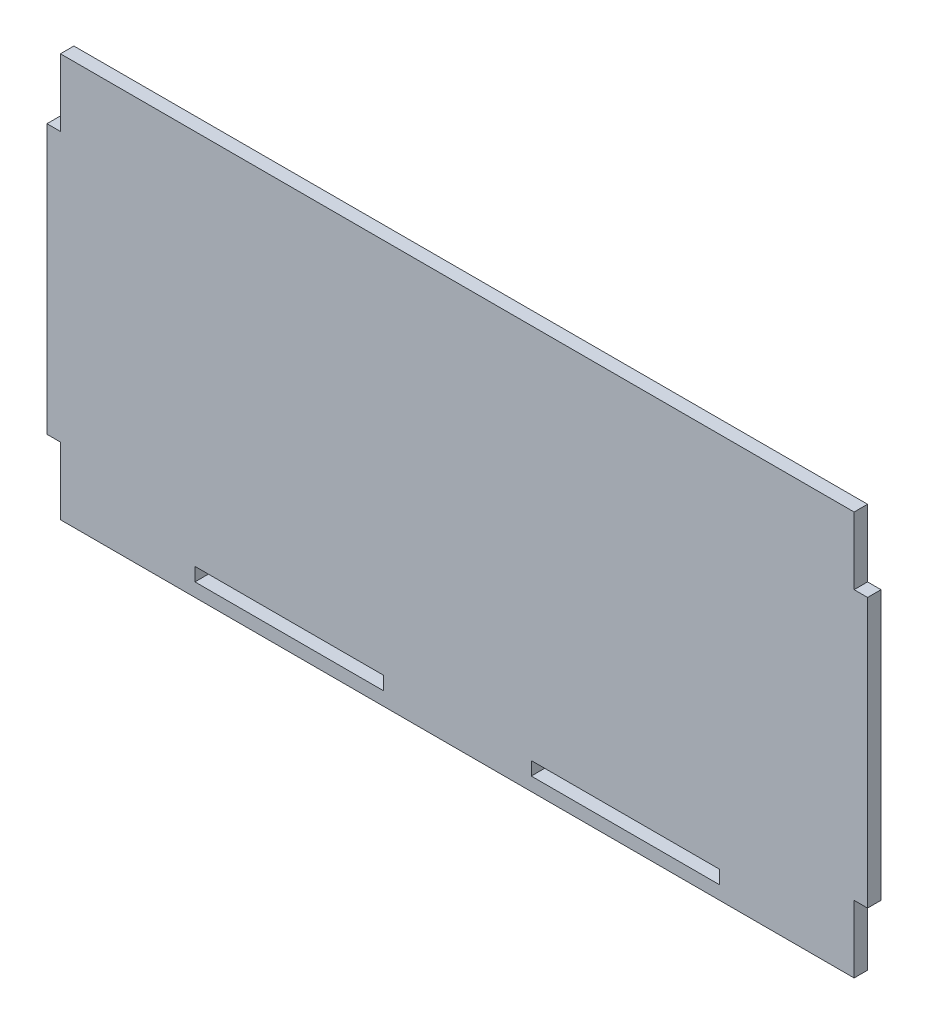
ISO-10303-21;
HEADER;
FILE_DESCRIPTION(('STEP AP214'),'2;1');
FILE_NAME('part.step','',(''),(''),'','','');
FILE_SCHEMA(('AUTOMOTIVE_DESIGN { 1 0 10303 214 1 1 1 1 }'));
ENDSEC;
DATA;
#1=APPLICATION_CONTEXT('core data for automotive mechanical design processes');
#2=APPLICATION_PROTOCOL_DEFINITION('international standard','automotive_design',2000,#1);
#3=PRODUCT_CONTEXT('',#1,'mechanical');
#4=PRODUCT('Part','Part','',(#3));
#5=PRODUCT_RELATED_PRODUCT_CATEGORY('part','',(#4));
#6=PRODUCT_DEFINITION_FORMATION('','',#4);
#7=PRODUCT_DEFINITION_CONTEXT('part definition',#1,'design');
#8=PRODUCT_DEFINITION('design','',#6,#7);
#9=PRODUCT_DEFINITION_SHAPE('','',#8);
#10=(LENGTH_UNIT() NAMED_UNIT(*) SI_UNIT(.MILLI.,.METRE.));
#11=(NAMED_UNIT(*) PLANE_ANGLE_UNIT() SI_UNIT($,.RADIAN.));
#12=(NAMED_UNIT(*) SI_UNIT($,.STERADIAN.) SOLID_ANGLE_UNIT());
#13=UNCERTAINTY_MEASURE_WITH_UNIT(LENGTH_MEASURE(1.E-05),#10,'distance_accuracy_value','');
#14=(GEOMETRIC_REPRESENTATION_CONTEXT(3) GLOBAL_UNCERTAINTY_ASSIGNED_CONTEXT((#13)) GLOBAL_UNIT_ASSIGNED_CONTEXT((#10,
#11,#12)) REPRESENTATION_CONTEXT('',''));
#15=CARTESIAN_POINT('',(0.,0.,0.));
#16=DIRECTION('',(0.,0.,1.));
#17=DIRECTION('',(1.,0.,0.));
#18=AXIS2_PLACEMENT_3D('',#15,#16,#17);
#19=CARTESIAN_POINT('',(0.,125.,5.));
#20=DIRECTION('',(0.,-1.,0.));
#21=DIRECTION('',(0.,0.,-1.));
#22=AXIS2_PLACEMENT_3D('',#19,#20,#21);
#23=PLANE('',#22);
#24=DIRECTION('',(-1.,0.,0.));
#25=VECTOR('',#24,1.);
#26=CARTESIAN_POINT('',(0.,125.,0.));
#27=LINE('',#26,#25);
#28=CARTESIAN_POINT('',(-295.,125.,0.));
#29=VERTEX_POINT('',#28);
#30=CARTESIAN_POINT('',(-300.,125.,0.));
#31=VERTEX_POINT('',#30);
#32=EDGE_CURVE('E207',#29,#31,#27,.T.);
#33=ORIENTED_EDGE('',*,*,#32,.T.);
#34=DIRECTION('',(0.,0.,-1.));
#35=VECTOR('',#34,1.);
#36=CARTESIAN_POINT('',(-300.,125.,5.));
#37=LINE('',#36,#35);
#38=CARTESIAN_POINT('',(-300.,125.,5.));
#39=VERTEX_POINT('',#38);
#40=EDGE_CURVE('E11',#39,#31,#37,.T.);
#41=ORIENTED_EDGE('',*,*,#40,.F.);
#42=DIRECTION('',(-1.,0.,0.));
#43=VECTOR('',#42,1.);
#44=CARTESIAN_POINT('',(0.,125.,5.));
#45=LINE('',#44,#43);
#46=CARTESIAN_POINT('',(-295.,125.,5.));
#47=VERTEX_POINT('',#46);
#48=EDGE_CURVE('E240',#47,#39,#45,.T.);
#49=ORIENTED_EDGE('',*,*,#48,.F.);
#50=DIRECTION('',(0.,0.,-1.));
#51=VECTOR('',#50,1.);
#52=CARTESIAN_POINT('',(-295.,125.,5.));
#53=LINE('',#52,#51);
#54=EDGE_CURVE('E298',#47,#29,#53,.T.);
#55=ORIENTED_EDGE('',*,*,#54,.T.);
#56=EDGE_LOOP('',(#33,#41,#49,#55));
#57=FACE_BOUND('',#56,.T.);
#58=ADVANCED_FACE('F34',(#57),#23,.F.);
#59=CARTESIAN_POINT('',(-300.,1.66533453693774E-13,5.));
#60=DIRECTION('',(1.,0.,0.));
#61=DIRECTION('',(0.,1.,0.));
#62=AXIS2_PLACEMENT_3D('',#59,#60,#61);
#63=PLANE('',#62);
#64=DIRECTION('',(0.,-1.,0.));
#65=VECTOR('',#64,1.);
#66=CARTESIAN_POINT('',(-300.,1.66533453693774E-13,0.));
#67=LINE('',#66,#65);
#68=CARTESIAN_POINT('',(-300.,25.,0.));
#69=VERTEX_POINT('',#68);
#70=EDGE_CURVE('E271',#31,#69,#67,.T.);
#71=ORIENTED_EDGE('',*,*,#70,.T.);
#72=DIRECTION('',(0.,0.,-1.));
#73=VECTOR('',#72,1.);
#74=CARTESIAN_POINT('',(-300.,25.,5.));
#75=LINE('',#74,#73);
#76=CARTESIAN_POINT('',(-300.,25.,5.));
#77=VERTEX_POINT('',#76);
#78=EDGE_CURVE('E41',#77,#69,#75,.T.);
#79=ORIENTED_EDGE('',*,*,#78,.F.);
#80=DIRECTION('',(0.,-1.,0.));
#81=VECTOR('',#80,1.);
#82=CARTESIAN_POINT('',(-300.,1.66533453693774E-13,5.));
#83=LINE('',#82,#81);
#84=EDGE_CURVE('E243',#39,#77,#83,.T.);
#85=ORIENTED_EDGE('',*,*,#84,.F.);
#86=ORIENTED_EDGE('',*,*,#40,.T.);
#87=EDGE_LOOP('',(#71,#79,#85,#86));
#88=FACE_BOUND('',#87,.T.);
#89=ADVANCED_FACE('F325',(#88),#63,.F.);
#90=CARTESIAN_POINT('',(0.,25.0000000000002,5.));
#91=DIRECTION('',(0.,-1.,0.));
#92=DIRECTION('',(1.,0.,0.));
#93=AXIS2_PLACEMENT_3D('',#90,#91,#92);
#94=PLANE('',#93);
#95=DIRECTION('',(-1.,0.,0.));
#96=VECTOR('',#95,1.);
#97=CARTESIAN_POINT('',(0.,25.0000000000002,0.));
#98=LINE('',#97,#96);
#99=CARTESIAN_POINT('',(-295.,25.,0.));
#100=VERTEX_POINT('',#99);
#101=EDGE_CURVE('E274',#100,#69,#98,.T.);
#102=ORIENTED_EDGE('',*,*,#101,.F.);
#103=DIRECTION('',(0.,0.,-1.));
#104=VECTOR('',#103,1.);
#105=CARTESIAN_POINT('',(-295.,25.,5.));
#106=LINE('',#105,#104);
#107=CARTESIAN_POINT('',(-295.,25.,5.));
#108=VERTEX_POINT('',#107);
#109=EDGE_CURVE('E318',#108,#100,#106,.T.);
#110=ORIENTED_EDGE('',*,*,#109,.F.);
#111=DIRECTION('',(-1.,0.,0.));
#112=VECTOR('',#111,1.);
#113=CARTESIAN_POINT('',(0.,25.0000000000002,5.));
#114=LINE('',#113,#112);
#115=EDGE_CURVE('E246',#108,#77,#114,.T.);
#116=ORIENTED_EDGE('',*,*,#115,.T.);
#117=ORIENTED_EDGE('',*,*,#78,.T.);
#118=EDGE_LOOP('',(#102,#110,#116,#117));
#119=FACE_BOUND('',#118,.T.);
#120=ADVANCED_FACE('F322',(#119),#94,.T.);
#121=CARTESIAN_POINT('',(-295.,0.,5.));
#122=DIRECTION('',(-1.,0.,0.));
#123=DIRECTION('',(0.,0.,1.));
#124=AXIS2_PLACEMENT_3D('',#121,#122,#123);
#125=PLANE('',#124);
#126=DIRECTION('',(0.,1.,0.));
#127=VECTOR('',#126,1.);
#128=CARTESIAN_POINT('',(-295.,0.,0.));
#129=LINE('',#128,#127);
#130=CARTESIAN_POINT('',(-295.,0.,0.));
#131=VERTEX_POINT('',#130);
#132=EDGE_CURVE('E277',#131,#100,#129,.T.);
#133=ORIENTED_EDGE('',*,*,#132,.F.);
#134=DIRECTION('',(0.,0.,-1.));
#135=VECTOR('',#134,1.);
#136=CARTESIAN_POINT('',(-295.,0.,5.));
#137=LINE('',#136,#135);
#138=CARTESIAN_POINT('',(-295.,0.,5.));
#139=VERTEX_POINT('',#138);
#140=EDGE_CURVE('E316',#139,#131,#137,.T.);
#141=ORIENTED_EDGE('',*,*,#140,.F.);
#142=DIRECTION('',(0.,1.,0.));
#143=VECTOR('',#142,1.);
#144=CARTESIAN_POINT('',(-295.,0.,5.));
#145=LINE('',#144,#143);
#146=EDGE_CURVE('E249',#139,#108,#145,.T.);
#147=ORIENTED_EDGE('',*,*,#146,.T.);
#148=ORIENTED_EDGE('',*,*,#109,.T.);
#149=EDGE_LOOP('',(#133,#141,#147,#148));
#150=FACE_BOUND('',#149,.T.);
#151=ADVANCED_FACE('F333',(#150),#125,.T.);
#152=CARTESIAN_POINT('',(0.,0.,5.));
#153=DIRECTION('',(0.,-1.,0.));
#154=DIRECTION('',(0.,0.,-1.));
#155=AXIS2_PLACEMENT_3D('',#152,#153,#154);
#156=PLANE('',#155);
#157=DIRECTION('',(-1.,0.,0.));
#158=VECTOR('',#157,1.);
#159=CARTESIAN_POINT('',(0.,0.,0.));
#160=LINE('',#159,#158);
#161=CARTESIAN_POINT('',(0.,0.,0.));
#162=VERTEX_POINT('',#161);
#163=EDGE_CURVE('E280',#162,#131,#160,.T.);
#164=ORIENTED_EDGE('',*,*,#163,.F.);
#165=DIRECTION('',(0.,0.,-1.));
#166=VECTOR('',#165,1.);
#167=CARTESIAN_POINT('',(0.,0.,5.));
#168=LINE('',#167,#166);
#169=CARTESIAN_POINT('',(0.,0.,5.));
#170=VERTEX_POINT('',#169);
#171=EDGE_CURVE('E314',#170,#162,#168,.T.);
#172=ORIENTED_EDGE('',*,*,#171,.F.);
#173=DIRECTION('',(-1.,0.,0.));
#174=VECTOR('',#173,1.);
#175=CARTESIAN_POINT('',(0.,0.,5.));
#176=LINE('',#175,#174);
#177=EDGE_CURVE('E252',#170,#139,#176,.T.);
#178=ORIENTED_EDGE('',*,*,#177,.T.);
#179=ORIENTED_EDGE('',*,*,#140,.T.);
#180=EDGE_LOOP('',(#164,#172,#178,#179));
#181=FACE_BOUND('',#180,.T.);
#182=ADVANCED_FACE('F373',(#181),#156,.T.);
#183=CARTESIAN_POINT('',(0.,0.,5.));
#184=DIRECTION('',(-1.,0.,0.));
#185=DIRECTION('',(0.,-1.,0.));
#186=AXIS2_PLACEMENT_3D('',#183,#184,#185);
#187=PLANE('',#186);
#188=DIRECTION('',(0.,1.,0.));
#189=VECTOR('',#188,1.);
#190=CARTESIAN_POINT('',(0.,0.,0.));
#191=LINE('',#190,#189);
#192=CARTESIAN_POINT('',(0.,25.,0.));
#193=VERTEX_POINT('',#192);
#194=EDGE_CURVE('E283',#162,#193,#191,.T.);
#195=ORIENTED_EDGE('',*,*,#194,.T.);
#196=DIRECTION('',(0.,0.,-1.));
#197=VECTOR('',#196,1.);
#198=CARTESIAN_POINT('',(0.,25.,5.));
#199=LINE('',#198,#197);
#200=CARTESIAN_POINT('',(0.,25.,5.));
#201=VERTEX_POINT('',#200);
#202=EDGE_CURVE('E311',#201,#193,#199,.T.);
#203=ORIENTED_EDGE('',*,*,#202,.F.);
#204=DIRECTION('',(0.,1.,0.));
#205=VECTOR('',#204,1.);
#206=CARTESIAN_POINT('',(0.,0.,5.));
#207=LINE('',#206,#205);
#208=EDGE_CURVE('E256',#170,#201,#207,.T.);
#209=ORIENTED_EDGE('',*,*,#208,.F.);
#210=ORIENTED_EDGE('',*,*,#171,.T.);
#211=EDGE_LOOP('',(#195,#203,#209,#210));
#212=FACE_BOUND('',#211,.T.);
#213=ADVANCED_FACE('F371',(#212),#187,.F.);
#214=CARTESIAN_POINT('',(0.,25.,5.));
#215=DIRECTION('',(0.,1.,0.));
#216=DIRECTION('',(-1.,0.,0.));
#217=AXIS2_PLACEMENT_3D('',#214,#215,#216);
#218=PLANE('',#217);
#219=DIRECTION('',(1.,0.,0.));
#220=VECTOR('',#219,1.);
#221=CARTESIAN_POINT('',(0.,25.,0.));
#222=LINE('',#221,#220);
#223=CARTESIAN_POINT('',(5.,25.,0.));
#224=VERTEX_POINT('',#223);
#225=EDGE_CURVE('E285',#193,#224,#222,.T.);
#226=ORIENTED_EDGE('',*,*,#225,.T.);
#227=DIRECTION('',(0.,0.,-1.));
#228=VECTOR('',#227,1.);
#229=CARTESIAN_POINT('',(5.,25.,5.));
#230=LINE('',#229,#228);
#231=CARTESIAN_POINT('',(5.,25.,5.));
#232=VERTEX_POINT('',#231);
#233=EDGE_CURVE('E309',#232,#224,#230,.T.);
#234=ORIENTED_EDGE('',*,*,#233,.F.);
#235=DIRECTION('',(1.,0.,0.));
#236=VECTOR('',#235,1.);
#237=CARTESIAN_POINT('',(0.,25.,5.));
#238=LINE('',#237,#236);
#239=EDGE_CURVE('E258',#201,#232,#238,.T.);
#240=ORIENTED_EDGE('',*,*,#239,.F.);
#241=ORIENTED_EDGE('',*,*,#202,.T.);
#242=EDGE_LOOP('',(#226,#234,#240,#241));
#243=FACE_BOUND('',#242,.T.);
#244=ADVANCED_FACE('F366',(#243),#218,.F.);
#245=CARTESIAN_POINT('',(5.00000000000002,0.,5.));
#246=DIRECTION('',(1.,0.,0.));
#247=DIRECTION('',(0.,1.,0.));
#248=AXIS2_PLACEMENT_3D('',#245,#246,#247);
#249=PLANE('',#248);
#250=DIRECTION('',(0.,-1.,0.));
#251=VECTOR('',#250,1.);
#252=CARTESIAN_POINT('',(5.00000000000002,0.,0.));
#253=LINE('',#252,#251);
#254=CARTESIAN_POINT('',(4.99999999999995,125.,0.));
#255=VERTEX_POINT('',#254);
#256=EDGE_CURVE('E289',#255,#224,#253,.T.);
#257=ORIENTED_EDGE('',*,*,#256,.F.);
#258=DIRECTION('',(0.,0.,-1.));
#259=VECTOR('',#258,1.);
#260=CARTESIAN_POINT('',(4.99999999999995,125.,5.));
#261=LINE('',#260,#259);
#262=CARTESIAN_POINT('',(4.99999999999995,125.,5.));
#263=VERTEX_POINT('',#262);
#264=EDGE_CURVE('E307',#263,#255,#261,.T.);
#265=ORIENTED_EDGE('',*,*,#264,.F.);
#266=DIRECTION('',(0.,-1.,0.));
#267=VECTOR('',#266,1.);
#268=CARTESIAN_POINT('',(5.00000000000002,0.,5.));
#269=LINE('',#268,#267);
#270=EDGE_CURVE('E261',#263,#232,#269,.T.);
#271=ORIENTED_EDGE('',*,*,#270,.T.);
#272=ORIENTED_EDGE('',*,*,#233,.T.);
#273=EDGE_LOOP('',(#257,#265,#271,#272));
#274=FACE_BOUND('',#273,.T.);
#275=ADVANCED_FACE('F362',(#274),#249,.T.);
#276=CARTESIAN_POINT('',(0.,125.,5.));
#277=DIRECTION('',(0.,1.,0.));
#278=DIRECTION('',(0.,0.,1.));
#279=AXIS2_PLACEMENT_3D('',#276,#277,#278);
#280=PLANE('',#279);
#281=DIRECTION('',(1.,0.,0.));
#282=VECTOR('',#281,1.);
#283=CARTESIAN_POINT('',(0.,125.,0.));
#284=LINE('',#283,#282);
#285=CARTESIAN_POINT('',(0.,125.,0.));
#286=VERTEX_POINT('',#285);
#287=EDGE_CURVE('E292',#286,#255,#284,.T.);
#288=ORIENTED_EDGE('',*,*,#287,.F.);
#289=DIRECTION('',(0.,0.,-1.));
#290=VECTOR('',#289,1.);
#291=CARTESIAN_POINT('',(0.,125.,5.));
#292=LINE('',#291,#290);
#293=CARTESIAN_POINT('',(0.,125.,5.));
#294=VERTEX_POINT('',#293);
#295=EDGE_CURVE('E305',#294,#286,#292,.T.);
#296=ORIENTED_EDGE('',*,*,#295,.F.);
#297=DIRECTION('',(1.,0.,0.));
#298=VECTOR('',#297,1.);
#299=CARTESIAN_POINT('',(0.,125.,5.));
#300=LINE('',#299,#298);
#301=EDGE_CURVE('E264',#294,#263,#300,.T.);
#302=ORIENTED_EDGE('',*,*,#301,.T.);
#303=ORIENTED_EDGE('',*,*,#264,.T.);
#304=EDGE_LOOP('',(#288,#296,#302,#303));
#305=FACE_BOUND('',#304,.T.);
#306=ADVANCED_FACE('F356',(#305),#280,.T.);
#307=CARTESIAN_POINT('',(0.,150.,0.));
#308=VERTEX_POINT('',#307);
#309=EDGE_CURVE('E286',#286,#308,#191,.T.);
#310=ORIENTED_EDGE('',*,*,#309,.T.);
#311=DIRECTION('',(0.,0.,-1.));
#312=VECTOR('',#311,1.);
#313=CARTESIAN_POINT('',(0.,150.,5.));
#314=LINE('',#313,#312);
#315=CARTESIAN_POINT('',(0.,150.,5.));
#316=VERTEX_POINT('',#315);
#317=EDGE_CURVE('E302',#316,#308,#314,.T.);
#318=ORIENTED_EDGE('',*,*,#317,.F.);
#319=EDGE_CURVE('E259',#294,#316,#207,.T.);
#320=ORIENTED_EDGE('',*,*,#319,.F.);
#321=ORIENTED_EDGE('',*,*,#295,.T.);
#322=EDGE_LOOP('',(#310,#318,#320,#321));
#323=FACE_BOUND('',#322,.T.);
#324=ADVANCED_FACE('F374',(#323),#187,.F.);
#325=CARTESIAN_POINT('',(0.,150.,5.));
#326=DIRECTION('',(0.,-1.,0.));
#327=DIRECTION('',(1.,0.,0.));
#328=AXIS2_PLACEMENT_3D('',#325,#326,#327);
#329=PLANE('',#328);
#330=DIRECTION('',(-1.,0.,0.));
#331=VECTOR('',#330,1.);
#332=CARTESIAN_POINT('',(0.,150.,0.));
#333=LINE('',#332,#331);
#334=CARTESIAN_POINT('',(-295.,150.,0.));
#335=VERTEX_POINT('',#334);
#336=EDGE_CURVE('E295',#308,#335,#333,.T.);
#337=ORIENTED_EDGE('',*,*,#336,.T.);
#338=DIRECTION('',(0.,0.,-1.));
#339=VECTOR('',#338,1.);
#340=CARTESIAN_POINT('',(-295.,150.,5.));
#341=LINE('',#340,#339);
#342=CARTESIAN_POINT('',(-295.,150.,5.));
#343=VERTEX_POINT('',#342);
#344=EDGE_CURVE('E300',#343,#335,#341,.T.);
#345=ORIENTED_EDGE('',*,*,#344,.F.);
#346=DIRECTION('',(-1.,0.,0.));
#347=VECTOR('',#346,1.);
#348=CARTESIAN_POINT('',(0.,150.,5.));
#349=LINE('',#348,#347);
#350=EDGE_CURVE('E267',#316,#343,#349,.T.);
#351=ORIENTED_EDGE('',*,*,#350,.F.);
#352=ORIENTED_EDGE('',*,*,#317,.T.);
#353=EDGE_LOOP('',(#337,#345,#351,#352));
#354=FACE_BOUND('',#353,.T.);
#355=ADVANCED_FACE('F350',(#354),#329,.F.);
#356=EDGE_CURVE('E244',#29,#335,#129,.T.);
#357=ORIENTED_EDGE('',*,*,#356,.F.);
#358=ORIENTED_EDGE('',*,*,#54,.F.);
#359=EDGE_CURVE('E253',#47,#343,#145,.T.);
#360=ORIENTED_EDGE('',*,*,#359,.T.);
#361=ORIENTED_EDGE('',*,*,#344,.T.);
#362=EDGE_LOOP('',(#357,#358,#360,#361));
#363=FACE_BOUND('',#362,.T.);
#364=ADVANCED_FACE('F346',(#363),#125,.T.);
#365=CARTESIAN_POINT('',(0.,0.,5.));
#366=DIRECTION('',(0.,0.,1.));
#367=DIRECTION('',(1.,0.,0.));
#368=AXIS2_PLACEMENT_3D('',#365,#366,#367);
#369=PLANE('',#368);
#370=DIRECTION('',(0.,-1.,0.));
#371=VECTOR('',#370,1.);
#372=CARTESIAN_POINT('',(-245.,5.,5.));
#373=LINE('',#372,#371);
#374=CARTESIAN_POINT('',(-245.,10.,5.));
#375=VERTEX_POINT('',#374);
#376=CARTESIAN_POINT('',(-245.,5.,5.));
#377=VERTEX_POINT('',#376);
#378=EDGE_CURVE('E48',#375,#377,#373,.T.);
#379=ORIENTED_EDGE('',*,*,#378,.F.);
#380=DIRECTION('',(-1.,0.,0.));
#381=VECTOR('',#380,1.);
#382=CARTESIAN_POINT('',(-245.,10.,5.));
#383=LINE('',#382,#381);
#384=CARTESIAN_POINT('',(-175.,10.,5.));
#385=VERTEX_POINT('',#384);
#386=EDGE_CURVE('E191',#385,#375,#383,.T.);
#387=ORIENTED_EDGE('',*,*,#386,.F.);
#388=DIRECTION('',(0.,1.,0.));
#389=VECTOR('',#388,1.);
#390=CARTESIAN_POINT('',(-175.,5.,5.));
#391=LINE('',#390,#389);
#392=CARTESIAN_POINT('',(-175.,5.,5.));
#393=VERTEX_POINT('',#392);
#394=EDGE_CURVE('E194',#393,#385,#391,.T.);
#395=ORIENTED_EDGE('',*,*,#394,.F.);
#396=DIRECTION('',(1.,0.,0.));
#397=VECTOR('',#396,1.);
#398=CARTESIAN_POINT('',(-245.,5.,5.));
#399=LINE('',#398,#397);
#400=EDGE_CURVE('E200',#377,#393,#399,.T.);
#401=ORIENTED_EDGE('',*,*,#400,.F.);
#402=EDGE_LOOP('',(#379,#387,#395,#401));
#403=FACE_BOUND('',#402,.T.);
#404=DIRECTION('',(1.,0.,0.));
#405=VECTOR('',#404,1.);
#406=CARTESIAN_POINT('',(-50.,5.,5.));
#407=LINE('',#406,#405);
#408=CARTESIAN_POINT('',(-120.,5.,5.));
#409=VERTEX_POINT('',#408);
#410=CARTESIAN_POINT('',(-50.,5.,5.));
#411=VERTEX_POINT('',#410);
#412=EDGE_CURVE('E56',#409,#411,#407,.T.);
#413=ORIENTED_EDGE('',*,*,#412,.F.);
#414=DIRECTION('',(0.,-1.,0.));
#415=VECTOR('',#414,1.);
#416=CARTESIAN_POINT('',(-120.,5.,5.));
#417=LINE('',#416,#415);
#418=CARTESIAN_POINT('',(-120.,10.,5.));
#419=VERTEX_POINT('',#418);
#420=EDGE_CURVE('E215',#419,#409,#417,.T.);
#421=ORIENTED_EDGE('',*,*,#420,.F.);
#422=DIRECTION('',(-1.,0.,0.));
#423=VECTOR('',#422,1.);
#424=CARTESIAN_POINT('',(-50.,10.,5.));
#425=LINE('',#424,#423);
#426=CARTESIAN_POINT('',(-50.,10.,5.));
#427=VERTEX_POINT('',#426);
#428=EDGE_CURVE('E229',#427,#419,#425,.T.);
#429=ORIENTED_EDGE('',*,*,#428,.F.);
#430=DIRECTION('',(0.,1.,0.));
#431=VECTOR('',#430,1.);
#432=CARTESIAN_POINT('',(-50.,5.,5.));
#433=LINE('',#432,#431);
#434=EDGE_CURVE('E226',#411,#427,#433,.T.);
#435=ORIENTED_EDGE('',*,*,#434,.F.);
#436=EDGE_LOOP('',(#413,#421,#429,#435));
#437=FACE_BOUND('',#436,.T.);
#438=ORIENTED_EDGE('',*,*,#48,.T.);
#439=ORIENTED_EDGE('',*,*,#84,.T.);
#440=ORIENTED_EDGE('',*,*,#115,.F.);
#441=ORIENTED_EDGE('',*,*,#146,.F.);
#442=ORIENTED_EDGE('',*,*,#177,.F.);
#443=ORIENTED_EDGE('',*,*,#208,.T.);
#444=ORIENTED_EDGE('',*,*,#239,.T.);
#445=ORIENTED_EDGE('',*,*,#270,.F.);
#446=ORIENTED_EDGE('',*,*,#301,.F.);
#447=ORIENTED_EDGE('',*,*,#319,.T.);
#448=ORIENTED_EDGE('',*,*,#350,.T.);
#449=ORIENTED_EDGE('',*,*,#359,.F.);
#450=EDGE_LOOP('',(#438,#439,#440,#441,#442,#443,#444,#445,#446,#447,#448,#449));
#451=FACE_BOUND('',#450,.T.);
#452=ADVANCED_FACE('F336',(#403,#437,#451),#369,.T.);
#453=CARTESIAN_POINT('',(0.,0.,0.));
#454=DIRECTION('',(0.,0.,1.));
#455=DIRECTION('',(1.,0.,0.));
#456=AXIS2_PLACEMENT_3D('',#453,#454,#455);
#457=PLANE('',#456);
#458=DIRECTION('',(-1.,0.,0.));
#459=VECTOR('',#458,1.);
#460=CARTESIAN_POINT('',(-245.,10.,0.));
#461=LINE('',#460,#459);
#462=CARTESIAN_POINT('',(-175.,10.,0.));
#463=VERTEX_POINT('',#462);
#464=CARTESIAN_POINT('',(-245.,10.,0.));
#465=VERTEX_POINT('',#464);
#466=EDGE_CURVE('E178',#463,#465,#461,.T.);
#467=ORIENTED_EDGE('',*,*,#466,.T.);
#468=DIRECTION('',(0.,-1.,0.));
#469=VECTOR('',#468,1.);
#470=CARTESIAN_POINT('',(-245.,5.,0.));
#471=LINE('',#470,#469);
#472=CARTESIAN_POINT('',(-245.,5.,0.));
#473=VERTEX_POINT('',#472);
#474=EDGE_CURVE('E172',#465,#473,#471,.T.);
#475=ORIENTED_EDGE('',*,*,#474,.T.);
#476=DIRECTION('',(1.,0.,0.));
#477=VECTOR('',#476,1.);
#478=CARTESIAN_POINT('',(-245.,5.,0.));
#479=LINE('',#478,#477);
#480=CARTESIAN_POINT('',(-175.,5.,0.));
#481=VERTEX_POINT('',#480);
#482=EDGE_CURVE('E182',#473,#481,#479,.T.);
#483=ORIENTED_EDGE('',*,*,#482,.T.);
#484=DIRECTION('',(0.,1.,0.));
#485=VECTOR('',#484,1.);
#486=CARTESIAN_POINT('',(-175.,5.,0.));
#487=LINE('',#486,#485);
#488=EDGE_CURVE('E186',#481,#463,#487,.T.);
#489=ORIENTED_EDGE('',*,*,#488,.T.);
#490=EDGE_LOOP('',(#467,#475,#483,#489));
#491=FACE_BOUND('',#490,.T.);
#492=DIRECTION('',(0.,-1.,0.));
#493=VECTOR('',#492,1.);
#494=CARTESIAN_POINT('',(-120.,5.,0.));
#495=LINE('',#494,#493);
#496=CARTESIAN_POINT('',(-120.,10.,0.));
#497=VERTEX_POINT('',#496);
#498=CARTESIAN_POINT('',(-120.,5.,0.));
#499=VERTEX_POINT('',#498);
#500=EDGE_CURVE('E221',#497,#499,#495,.T.);
#501=ORIENTED_EDGE('',*,*,#500,.T.);
#502=DIRECTION('',(1.,0.,0.));
#503=VECTOR('',#502,1.);
#504=CARTESIAN_POINT('',(-50.,5.,0.));
#505=LINE('',#504,#503);
#506=CARTESIAN_POINT('',(-50.,5.,0.));
#507=VERTEX_POINT('',#506);
#508=EDGE_CURVE('E211',#499,#507,#505,.T.);
#509=ORIENTED_EDGE('',*,*,#508,.T.);
#510=DIRECTION('',(0.,1.,0.));
#511=VECTOR('',#510,1.);
#512=CARTESIAN_POINT('',(-50.,5.,0.));
#513=LINE('',#512,#511);
#514=CARTESIAN_POINT('',(-50.,10.,0.));
#515=VERTEX_POINT('',#514);
#516=EDGE_CURVE('E214',#507,#515,#513,.T.);
#517=ORIENTED_EDGE('',*,*,#516,.T.);
#518=DIRECTION('',(-1.,0.,0.));
#519=VECTOR('',#518,1.);
#520=CARTESIAN_POINT('',(-50.,10.,0.));
#521=LINE('',#520,#519);
#522=EDGE_CURVE('E218',#515,#497,#521,.T.);
#523=ORIENTED_EDGE('',*,*,#522,.T.);
#524=EDGE_LOOP('',(#501,#509,#517,#523));
#525=FACE_BOUND('',#524,.T.);
#526=ORIENTED_EDGE('',*,*,#32,.F.);
#527=ORIENTED_EDGE('',*,*,#356,.T.);
#528=ORIENTED_EDGE('',*,*,#336,.F.);
#529=ORIENTED_EDGE('',*,*,#309,.F.);
#530=ORIENTED_EDGE('',*,*,#287,.T.);
#531=ORIENTED_EDGE('',*,*,#256,.T.);
#532=ORIENTED_EDGE('',*,*,#225,.F.);
#533=ORIENTED_EDGE('',*,*,#194,.F.);
#534=ORIENTED_EDGE('',*,*,#163,.T.);
#535=ORIENTED_EDGE('',*,*,#132,.T.);
#536=ORIENTED_EDGE('',*,*,#101,.T.);
#537=ORIENTED_EDGE('',*,*,#70,.F.);
#538=EDGE_LOOP('',(#526,#527,#528,#529,#530,#531,#532,#533,#534,#535,#536,#537));
#539=FACE_BOUND('',#538,.T.);
#540=ADVANCED_FACE('F188',(#491,#525,#539),#457,.F.);
#541=CARTESIAN_POINT('',(-50.,5.,0.));
#542=DIRECTION('',(0.,-1.,0.));
#543=DIRECTION('',(0.,0.,-1.));
#544=AXIS2_PLACEMENT_3D('',#541,#542,#543);
#545=PLANE('',#544);
#546=ORIENTED_EDGE('',*,*,#412,.T.);
#547=DIRECTION('',(0.,0.,1.));
#548=VECTOR('',#547,1.);
#549=CARTESIAN_POINT('',(-50.,5.,0.));
#550=LINE('',#549,#548);
#551=EDGE_CURVE('E224',#507,#411,#550,.T.);
#552=ORIENTED_EDGE('',*,*,#551,.F.);
#553=ORIENTED_EDGE('',*,*,#508,.F.);
#554=DIRECTION('',(0.,0.,1.));
#555=VECTOR('',#554,1.);
#556=CARTESIAN_POINT('',(-120.,5.,0.));
#557=LINE('',#556,#555);
#558=EDGE_CURVE('E201',#499,#409,#557,.T.);
#559=ORIENTED_EDGE('',*,*,#558,.T.);
#560=EDGE_LOOP('',(#546,#552,#553,#559));
#561=FACE_BOUND('',#560,.T.);
#562=ADVANCED_FACE('F447',(#561),#545,.F.);
#563=CARTESIAN_POINT('',(-120.,5.,0.));
#564=DIRECTION('',(-1.,0.,0.));
#565=DIRECTION('',(0.,0.,1.));
#566=AXIS2_PLACEMENT_3D('',#563,#564,#565);
#567=PLANE('',#566);
#568=ORIENTED_EDGE('',*,*,#420,.T.);
#569=ORIENTED_EDGE('',*,*,#558,.F.);
#570=ORIENTED_EDGE('',*,*,#500,.F.);
#571=DIRECTION('',(0.,0.,1.));
#572=VECTOR('',#571,1.);
#573=CARTESIAN_POINT('',(-120.,10.,0.));
#574=LINE('',#573,#572);
#575=EDGE_CURVE('E235',#497,#419,#574,.T.);
#576=ORIENTED_EDGE('',*,*,#575,.T.);
#577=EDGE_LOOP('',(#568,#569,#570,#576));
#578=FACE_BOUND('',#577,.T.);
#579=ADVANCED_FACE('F457',(#578),#567,.F.);
#580=CARTESIAN_POINT('',(-50.,10.,0.));
#581=DIRECTION('',(0.,1.,0.));
#582=DIRECTION('',(-1.,0.,0.));
#583=AXIS2_PLACEMENT_3D('',#580,#581,#582);
#584=PLANE('',#583);
#585=ORIENTED_EDGE('',*,*,#428,.T.);
#586=ORIENTED_EDGE('',*,*,#575,.F.);
#587=ORIENTED_EDGE('',*,*,#522,.F.);
#588=DIRECTION('',(0.,0.,1.));
#589=VECTOR('',#588,1.);
#590=CARTESIAN_POINT('',(-50.,10.,0.));
#591=LINE('',#590,#589);
#592=EDGE_CURVE('E237',#515,#427,#591,.T.);
#593=ORIENTED_EDGE('',*,*,#592,.T.);
#594=EDGE_LOOP('',(#585,#586,#587,#593));
#595=FACE_BOUND('',#594,.T.);
#596=ADVANCED_FACE('F466',(#595),#584,.F.);
#597=CARTESIAN_POINT('',(-50.,5.,0.));
#598=DIRECTION('',(1.,0.,0.));
#599=DIRECTION('',(0.,0.,-1.));
#600=AXIS2_PLACEMENT_3D('',#597,#598,#599);
#601=PLANE('',#600);
#602=ORIENTED_EDGE('',*,*,#434,.T.);
#603=ORIENTED_EDGE('',*,*,#592,.F.);
#604=ORIENTED_EDGE('',*,*,#516,.F.);
#605=ORIENTED_EDGE('',*,*,#551,.T.);
#606=EDGE_LOOP('',(#602,#603,#604,#605));
#607=FACE_BOUND('',#606,.T.);
#608=ADVANCED_FACE('F476',(#607),#601,.F.);
#609=CARTESIAN_POINT('',(-245.,5.,0.));
#610=DIRECTION('',(-1.,0.,0.));
#611=DIRECTION('',(0.,0.,1.));
#612=AXIS2_PLACEMENT_3D('',#609,#610,#611);
#613=PLANE('',#612);
#614=ORIENTED_EDGE('',*,*,#378,.T.);
#615=DIRECTION('',(0.,0.,1.));
#616=VECTOR('',#615,1.);
#617=CARTESIAN_POINT('',(-245.,5.,0.));
#618=LINE('',#617,#616);
#619=EDGE_CURVE('E168',#473,#377,#618,.T.);
#620=ORIENTED_EDGE('',*,*,#619,.F.);
#621=ORIENTED_EDGE('',*,*,#474,.F.);
#622=DIRECTION('',(0.,0.,1.));
#623=VECTOR('',#622,1.);
#624=CARTESIAN_POINT('',(-245.,10.,0.));
#625=LINE('',#624,#623);
#626=EDGE_CURVE('E205',#465,#375,#625,.T.);
#627=ORIENTED_EDGE('',*,*,#626,.T.);
#628=EDGE_LOOP('',(#614,#620,#621,#627));
#629=FACE_BOUND('',#628,.T.);
#630=ADVANCED_FACE('F170',(#629),#613,.F.);
#631=CARTESIAN_POINT('',(-245.,10.,0.));
#632=DIRECTION('',(0.,1.,0.));
#633=DIRECTION('',(-1.,0.,0.));
#634=AXIS2_PLACEMENT_3D('',#631,#632,#633);
#635=PLANE('',#634);
#636=ORIENTED_EDGE('',*,*,#386,.T.);
#637=ORIENTED_EDGE('',*,*,#626,.F.);
#638=ORIENTED_EDGE('',*,*,#466,.F.);
#639=DIRECTION('',(0.,0.,1.));
#640=VECTOR('',#639,1.);
#641=CARTESIAN_POINT('',(-175.,10.,0.));
#642=LINE('',#641,#640);
#643=EDGE_CURVE('E208',#463,#385,#642,.T.);
#644=ORIENTED_EDGE('',*,*,#643,.T.);
#645=EDGE_LOOP('',(#636,#637,#638,#644));
#646=FACE_BOUND('',#645,.T.);
#647=ADVANCED_FACE('F495',(#646),#635,.F.);
#648=CARTESIAN_POINT('',(-175.,5.,0.));
#649=DIRECTION('',(1.,0.,0.));
#650=DIRECTION('',(0.,0.,-1.));
#651=AXIS2_PLACEMENT_3D('',#648,#649,#650);
#652=PLANE('',#651);
#653=ORIENTED_EDGE('',*,*,#394,.T.);
#654=ORIENTED_EDGE('',*,*,#643,.F.);
#655=ORIENTED_EDGE('',*,*,#488,.F.);
#656=DIRECTION('',(0.,0.,1.));
#657=VECTOR('',#656,1.);
#658=CARTESIAN_POINT('',(-175.,5.,0.));
#659=LINE('',#658,#657);
#660=EDGE_CURVE('E177',#481,#393,#659,.T.);
#661=ORIENTED_EDGE('',*,*,#660,.T.);
#662=EDGE_LOOP('',(#653,#654,#655,#661));
#663=FACE_BOUND('',#662,.T.);
#664=ADVANCED_FACE('F504',(#663),#652,.F.);
#665=CARTESIAN_POINT('',(-245.,5.,0.));
#666=DIRECTION('',(0.,-1.,0.));
#667=DIRECTION('',(0.,0.,-1.));
#668=AXIS2_PLACEMENT_3D('',#665,#666,#667);
#669=PLANE('',#668);
#670=ORIENTED_EDGE('',*,*,#400,.T.);
#671=ORIENTED_EDGE('',*,*,#660,.F.);
#672=ORIENTED_EDGE('',*,*,#482,.F.);
#673=ORIENTED_EDGE('',*,*,#619,.T.);
#674=EDGE_LOOP('',(#670,#671,#672,#673));
#675=FACE_BOUND('',#674,.T.);
#676=ADVANCED_FACE('F183',(#675),#669,.F.);
#677=CLOSED_SHELL('',(#58,#89,#120,#151,#182,#213,#244,#275,#306,#324,#355,#364,#452,#540,#562,
#579,#596,#608,#630,#647,#664,#676));
#678=MANIFOLD_SOLID_BREP('B2',#677);
#679=ADVANCED_BREP_SHAPE_REPRESENTATION('',(#18,#678),#14);
#680=SHAPE_DEFINITION_REPRESENTATION(#9,#679);
ENDSEC;
END-ISO-10303-21;
